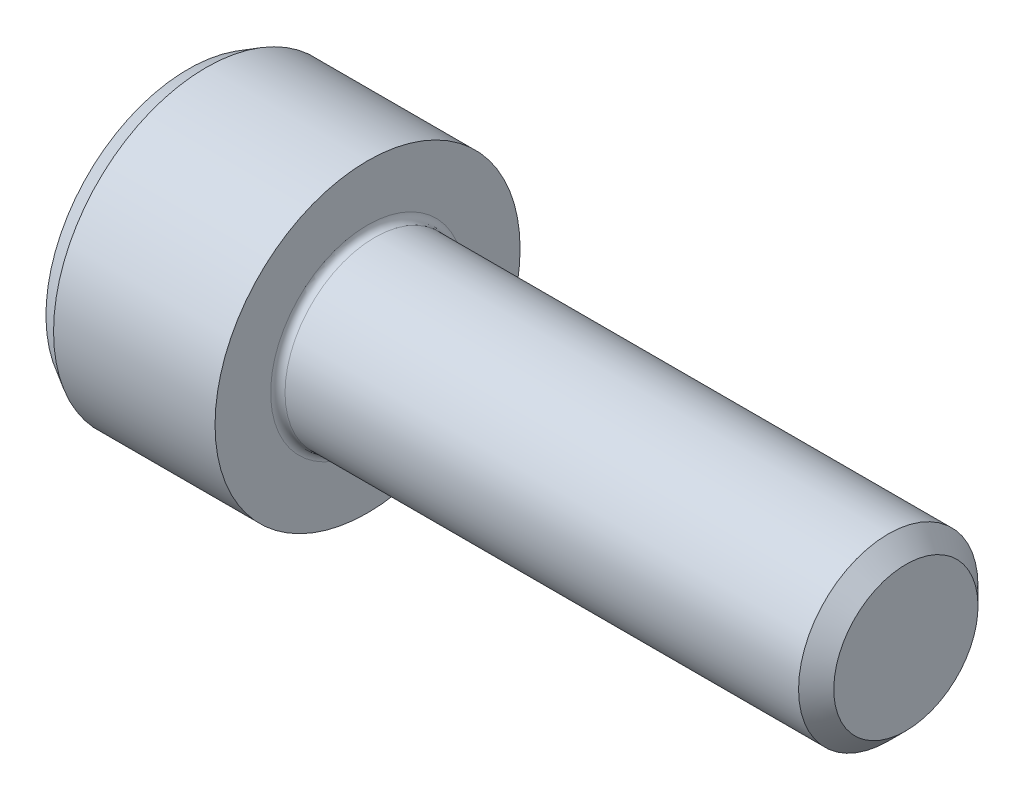
ISO-10303-21;
HEADER;
FILE_DESCRIPTION(('STEP AP214'),'2;1');
FILE_NAME('part.step','',(''),(''),'','','');
FILE_SCHEMA(('AUTOMOTIVE_DESIGN { 1 0 10303 214 1 1 1 1 }'));
ENDSEC;
DATA;
#1=APPLICATION_CONTEXT('core data for automotive mechanical design processes');
#2=APPLICATION_PROTOCOL_DEFINITION('international standard','automotive_design',2000,#1);
#3=PRODUCT_CONTEXT('',#1,'mechanical');
#4=PRODUCT('Part','Part','',(#3));
#5=PRODUCT_RELATED_PRODUCT_CATEGORY('part','',(#4));
#6=PRODUCT_DEFINITION_FORMATION('','',#4);
#7=PRODUCT_DEFINITION_CONTEXT('part definition',#1,'design');
#8=PRODUCT_DEFINITION('design','',#6,#7);
#9=PRODUCT_DEFINITION_SHAPE('','',#8);
#10=(LENGTH_UNIT() NAMED_UNIT(*) SI_UNIT(.MILLI.,.METRE.));
#11=(NAMED_UNIT(*) PLANE_ANGLE_UNIT() SI_UNIT($,.RADIAN.));
#12=(NAMED_UNIT(*) SI_UNIT($,.STERADIAN.) SOLID_ANGLE_UNIT());
#13=UNCERTAINTY_MEASURE_WITH_UNIT(LENGTH_MEASURE(1.E-05),#10,'distance_accuracy_value','');
#14=(GEOMETRIC_REPRESENTATION_CONTEXT(3) GLOBAL_UNCERTAINTY_ASSIGNED_CONTEXT((#13)) GLOBAL_UNIT_ASSIGNED_CONTEXT((#10,
#11,#12)) REPRESENTATION_CONTEXT('',''));
#15=CARTESIAN_POINT('',(0.,0.,0.));
#16=DIRECTION('',(0.,0.,1.));
#17=DIRECTION('',(1.,0.,0.));
#18=AXIS2_PLACEMENT_3D('',#15,#16,#17);
#19=CARTESIAN_POINT('',(-5.,0.,0.));
#20=DIRECTION('',(1.,0.,0.));
#21=DIRECTION('',(0.,1.,0.));
#22=AXIS2_PLACEMENT_3D('',#19,#20,#21);
#23=PLANE('',#22);
#24=CARTESIAN_POINT('',(-5.,0.,0.));
#25=DIRECTION('',(-1.,0.,0.));
#26=DIRECTION('',(0.,-1.,0.));
#27=AXIS2_PLACEMENT_3D('',#24,#25,#26);
#28=CIRCLE('',#27,3.96132486540518);
#29=CARTESIAN_POINT('',(-5.,-3.96132486540517,0.));
#30=VERTEX_POINT('',#29);
#31=EDGE_CURVE('E149',#30,#30,#28,.T.);
#32=ORIENTED_EDGE('',*,*,#31,.T.);
#33=EDGE_LOOP('',(#32));
#34=FACE_BOUND('',#33,.T.);
#35=DIRECTION('',(0.,0.5,-0.866025403784439));
#36=VECTOR('',#35,1.);
#37=CARTESIAN_POINT('',(-5.,-2.3094010767585,0.));
#38=LINE('',#37,#36);
#39=CARTESIAN_POINT('',(-5.,-2.3094010767585,0.));
#40=VERTEX_POINT('',#39);
#41=CARTESIAN_POINT('',(-5.,-1.15470053837925,-2.));
#42=VERTEX_POINT('',#41);
#43=EDGE_CURVE('E433',#40,#42,#38,.T.);
#44=ORIENTED_EDGE('',*,*,#43,.T.);
#45=DIRECTION('',(0.,1.,0.));
#46=VECTOR('',#45,1.);
#47=CARTESIAN_POINT('',(-5.,-1.15470053837925,-2.));
#48=LINE('',#47,#46);
#49=CARTESIAN_POINT('',(-5.,1.15470053837925,-2.));
#50=VERTEX_POINT('',#49);
#51=EDGE_CURVE('E435',#42,#50,#48,.T.);
#52=ORIENTED_EDGE('',*,*,#51,.T.);
#53=DIRECTION('',(0.,0.5,0.866025403784439));
#54=VECTOR('',#53,1.);
#55=CARTESIAN_POINT('',(-5.,1.15470053837925,-2.));
#56=LINE('',#55,#54);
#57=CARTESIAN_POINT('',(-5.,2.3094010767585,0.));
#58=VERTEX_POINT('',#57);
#59=EDGE_CURVE('E437',#50,#58,#56,.T.);
#60=ORIENTED_EDGE('',*,*,#59,.T.);
#61=DIRECTION('',(0.,-0.5,0.866025403784439));
#62=VECTOR('',#61,1.);
#63=CARTESIAN_POINT('',(-5.,2.3094010767585,0.));
#64=LINE('',#63,#62);
#65=CARTESIAN_POINT('',(-5.,1.15470053837925,2.));
#66=VERTEX_POINT('',#65);
#67=EDGE_CURVE('E123',#58,#66,#64,.T.);
#68=ORIENTED_EDGE('',*,*,#67,.T.);
#69=DIRECTION('',(0.,-1.,0.));
#70=VECTOR('',#69,1.);
#71=CARTESIAN_POINT('',(-5.,1.15470053837925,2.));
#72=LINE('',#71,#70);
#73=CARTESIAN_POINT('',(-5.,-1.15470053837925,2.));
#74=VERTEX_POINT('',#73);
#75=EDGE_CURVE('E430',#66,#74,#72,.T.);
#76=ORIENTED_EDGE('',*,*,#75,.T.);
#77=DIRECTION('',(0.,-0.5,-0.866025403784439));
#78=VECTOR('',#77,1.);
#79=CARTESIAN_POINT('',(-5.,-1.15470053837925,2.));
#80=LINE('',#79,#78);
#81=EDGE_CURVE('E138',#74,#40,#80,.T.);
#82=ORIENTED_EDGE('',*,*,#81,.T.);
#83=EDGE_LOOP('',(#44,#52,#60,#68,#76,#82));
#84=FACE_BOUND('',#83,.T.);
#85=ADVANCED_FACE('F39',(#34,#84),#23,.F.);
#86=CARTESIAN_POINT('',(15.,2.00950000000001,0.));
#87=DIRECTION('',(-1.,0.,0.));
#88=DIRECTION('',(0.,-1.,0.));
#89=AXIS2_PLACEMENT_3D('',#86,#87,#88);
#90=PLANE('',#89);
#91=CARTESIAN_POINT('',(15.,0.,0.));
#92=DIRECTION('',(-1.,0.,0.));
#93=DIRECTION('',(0.,-1.,0.));
#94=AXIS2_PLACEMENT_3D('',#91,#92,#93);
#95=CIRCLE('',#94,2.00950000000001);
#96=CARTESIAN_POINT('',(15.,-2.00950000000001,0.));
#97=VERTEX_POINT('',#96);
#98=EDGE_CURVE('E11',#97,#97,#95,.T.);
#99=ORIENTED_EDGE('',*,*,#98,.F.);
#100=EDGE_LOOP('',(#99));
#101=FACE_BOUND('',#100,.T.);
#102=ADVANCED_FACE('F41',(#101),#90,.F.);
#103=CARTESIAN_POINT('',(15.,0.,0.));
#104=DIRECTION('',(-1.,0.,0.));
#105=DIRECTION('',(0.,-1.,0.));
#106=AXIS2_PLACEMENT_3D('',#103,#104,#105);
#107=CONICAL_SURFACE('',#106,2.00950000000001,0.785398163397447);
#108=CARTESIAN_POINT('',(14.5095,0.,0.));
#109=DIRECTION('',(-1.,0.,0.));
#110=DIRECTION('',(0.,-1.,0.));
#111=AXIS2_PLACEMENT_3D('',#108,#109,#110);
#112=CIRCLE('',#111,2.5);
#113=CARTESIAN_POINT('',(14.5095,-2.5,0.));
#114=VERTEX_POINT('',#113);
#115=EDGE_CURVE('E47',#114,#114,#112,.T.);
#116=ORIENTED_EDGE('',*,*,#115,.F.);
#117=EDGE_LOOP('',(#116));
#118=FACE_BOUND('',#117,.T.);
#119=ORIENTED_EDGE('',*,*,#98,.T.);
#120=EDGE_LOOP('',(#119));
#121=FACE_BOUND('',#120,.T.);
#122=ADVANCED_FACE('F169',(#118,#121),#107,.T.);
#123=CARTESIAN_POINT('',(15.,0.,0.));
#124=DIRECTION('',(-1.,0.,0.));
#125=DIRECTION('',(0.,-1.,0.));
#126=AXIS2_PLACEMENT_3D('',#123,#124,#125);
#127=CYLINDRICAL_SURFACE('',#126,2.5);
#128=CARTESIAN_POINT('',(0.199999999999987,0.,0.));
#129=DIRECTION('',(-1.,0.,0.));
#130=DIRECTION('',(0.,-1.,0.));
#131=AXIS2_PLACEMENT_3D('',#128,#129,#130);
#132=CIRCLE('',#131,2.49999999999999);
#133=CARTESIAN_POINT('',(0.199999999999986,-2.49999999999999,0.));
#134=VERTEX_POINT('',#133);
#135=EDGE_CURVE('E162',#134,#134,#132,.T.);
#136=ORIENTED_EDGE('',*,*,#135,.F.);
#137=EDGE_LOOP('',(#136));
#138=FACE_BOUND('',#137,.T.);
#139=ORIENTED_EDGE('',*,*,#115,.T.);
#140=EDGE_LOOP('',(#139));
#141=FACE_BOUND('',#140,.T.);
#142=ADVANCED_FACE('F167',(#138,#141),#127,.T.);
#143=CARTESIAN_POINT('',(0.199999999999999,0.,0.));
#144=DIRECTION('',(-1.,0.,0.));
#145=DIRECTION('',(0.,-1.,0.));
#146=AXIS2_PLACEMENT_3D('',#143,#144,#145);
#147=TOROIDAL_SURFACE('',#146,2.7,0.200000000000001);
#148=CARTESIAN_POINT('',(0.,0.,0.));
#149=DIRECTION('',(-1.,0.,0.));
#150=DIRECTION('',(0.,-1.,0.));
#151=AXIS2_PLACEMENT_3D('',#148,#149,#150);
#152=CIRCLE('',#151,2.69999999999999);
#153=CARTESIAN_POINT('',(0.,-2.69999999999999,0.));
#154=VERTEX_POINT('',#153);
#155=EDGE_CURVE('E159',#154,#154,#152,.T.);
#156=ORIENTED_EDGE('',*,*,#155,.F.);
#157=EDGE_LOOP('',(#156));
#158=FACE_BOUND('',#157,.T.);
#159=ORIENTED_EDGE('',*,*,#135,.T.);
#160=EDGE_LOOP('',(#159));
#161=FACE_BOUND('',#160,.T.);
#162=ADVANCED_FACE('F198',(#158,#161),#147,.F.);
#163=CARTESIAN_POINT('',(0.,4.25,0.));
#164=DIRECTION('',(-1.,0.,0.));
#165=DIRECTION('',(0.,-1.,0.));
#166=AXIS2_PLACEMENT_3D('',#163,#164,#165);
#167=PLANE('',#166);
#168=CARTESIAN_POINT('',(0.,0.,0.));
#169=DIRECTION('',(-1.,0.,0.));
#170=DIRECTION('',(0.,-1.,0.));
#171=AXIS2_PLACEMENT_3D('',#168,#169,#170);
#172=CIRCLE('',#171,4.24999999999999);
#173=CARTESIAN_POINT('',(0.,-4.24999999999999,0.));
#174=VERTEX_POINT('',#173);
#175=EDGE_CURVE('E156',#174,#174,#172,.T.);
#176=ORIENTED_EDGE('',*,*,#175,.F.);
#177=EDGE_LOOP('',(#176));
#178=FACE_BOUND('',#177,.T.);
#179=ORIENTED_EDGE('',*,*,#155,.T.);
#180=EDGE_LOOP('',(#179));
#181=FACE_BOUND('',#180,.T.);
#182=ADVANCED_FACE('F194',(#178,#181),#167,.F.);
#183=CARTESIAN_POINT('',(15.,0.,0.));
#184=DIRECTION('',(-1.,0.,0.));
#185=DIRECTION('',(0.,-1.,0.));
#186=AXIS2_PLACEMENT_3D('',#183,#184,#185);
#187=CYLINDRICAL_SURFACE('',#186,4.24999999999999);
#188=CARTESIAN_POINT('',(-4.5,0.,0.));
#189=DIRECTION('',(-1.,0.,0.));
#190=DIRECTION('',(0.,-1.,0.));
#191=AXIS2_PLACEMENT_3D('',#188,#189,#190);
#192=CIRCLE('',#191,4.24999999999999);
#193=CARTESIAN_POINT('',(-4.5,-4.24999999999999,0.));
#194=VERTEX_POINT('',#193);
#195=EDGE_CURVE('E153',#194,#194,#192,.T.);
#196=ORIENTED_EDGE('',*,*,#195,.F.);
#197=EDGE_LOOP('',(#196));
#198=FACE_BOUND('',#197,.T.);
#199=ORIENTED_EDGE('',*,*,#175,.T.);
#200=EDGE_LOOP('',(#199));
#201=FACE_BOUND('',#200,.T.);
#202=ADVANCED_FACE('F190',(#198,#201),#187,.T.);
#203=CARTESIAN_POINT('',(-4.5,0.,0.));
#204=DIRECTION('',(1.,0.,0.));
#205=DIRECTION('',(0.,1.,0.));
#206=AXIS2_PLACEMENT_3D('',#203,#204,#205);
#207=CONICAL_SURFACE('',#206,4.24999999999999,0.523598775598296);
#208=ORIENTED_EDGE('',*,*,#31,.F.);
#209=EDGE_LOOP('',(#208));
#210=FACE_BOUND('',#209,.T.);
#211=ORIENTED_EDGE('',*,*,#195,.T.);
#212=EDGE_LOOP('',(#211));
#213=FACE_BOUND('',#212,.T.);
#214=ADVANCED_FACE('F187',(#210,#213),#207,.T.);
#215=CARTESIAN_POINT('',(-2.5,1.15470053837925,2.));
#216=DIRECTION('',(0.,0.,-1.));
#217=DIRECTION('',(-1.,0.,0.));
#218=AXIS2_PLACEMENT_3D('',#215,#216,#217);
#219=PLANE('',#218);
#220=DIRECTION('',(0.,-1.,0.));
#221=VECTOR('',#220,1.);
#222=CARTESIAN_POINT('',(-2.5,1.15470053837925,2.));
#223=LINE('',#222,#221);
#224=CARTESIAN_POINT('',(-2.5,1.15470053837925,2.));
#225=VERTEX_POINT('',#224);
#226=CARTESIAN_POINT('',(-2.5,0.,2.));
#227=VERTEX_POINT('',#226);
#228=EDGE_CURVE('E120',#225,#227,#223,.T.);
#229=ORIENTED_EDGE('',*,*,#228,.T.);
#230=CARTESIAN_POINT('',(-2.5,-1.15470053837925,2.));
#231=VERTEX_POINT('',#230);
#232=EDGE_CURVE('E112',#227,#231,#223,.T.);
#233=ORIENTED_EDGE('',*,*,#232,.T.);
#234=DIRECTION('',(-1.,0.,0.));
#235=VECTOR('',#234,1.);
#236=CARTESIAN_POINT('',(-2.5,-1.15470053837925,2.));
#237=LINE('',#236,#235);
#238=EDGE_CURVE('E117',#231,#74,#237,.T.);
#239=ORIENTED_EDGE('',*,*,#238,.T.);
#240=ORIENTED_EDGE('',*,*,#75,.F.);
#241=DIRECTION('',(-1.,0.,0.));
#242=VECTOR('',#241,1.);
#243=CARTESIAN_POINT('',(-2.5,1.15470053837925,2.));
#244=LINE('',#243,#242);
#245=EDGE_CURVE('E425',#225,#66,#244,.T.);
#246=ORIENTED_EDGE('',*,*,#245,.F.);
#247=EDGE_LOOP('',(#229,#233,#239,#240,#246));
#248=FACE_BOUND('',#247,.T.);
#249=ADVANCED_FACE('F114',(#248),#219,.T.);
#250=CARTESIAN_POINT('',(-2.5,-1.15470053837925,2.));
#251=DIRECTION('',(0.,0.866025403784439,-0.5));
#252=DIRECTION('',(0.,0.5,0.866025403784439));
#253=AXIS2_PLACEMENT_3D('',#250,#251,#252);
#254=PLANE('',#253);
#255=DIRECTION('',(0.,-0.5,-0.866025403784439));
#256=VECTOR('',#255,1.);
#257=CARTESIAN_POINT('',(-2.5,-1.15470053837925,2.));
#258=LINE('',#257,#256);
#259=CARTESIAN_POINT('',(-2.5,-1.73205080756888,1.));
#260=VERTEX_POINT('',#259);
#261=EDGE_CURVE('E126',#231,#260,#258,.T.);
#262=ORIENTED_EDGE('',*,*,#261,.T.);
#263=CARTESIAN_POINT('',(-2.5,-2.3094010767585,0.));
#264=VERTEX_POINT('',#263);
#265=EDGE_CURVE('E133',#260,#264,#258,.T.);
#266=ORIENTED_EDGE('',*,*,#265,.T.);
#267=DIRECTION('',(-1.,0.,0.));
#268=VECTOR('',#267,1.);
#269=CARTESIAN_POINT('',(-2.5,-2.3094010767585,0.));
#270=LINE('',#269,#268);
#271=EDGE_CURVE('E139',#264,#40,#270,.T.);
#272=ORIENTED_EDGE('',*,*,#271,.T.);
#273=ORIENTED_EDGE('',*,*,#81,.F.);
#274=ORIENTED_EDGE('',*,*,#238,.F.);
#275=EDGE_LOOP('',(#262,#266,#272,#273,#274));
#276=FACE_BOUND('',#275,.T.);
#277=ADVANCED_FACE('F136',(#276),#254,.T.);
#278=CARTESIAN_POINT('',(-2.5,-2.3094010767585,0.));
#279=DIRECTION('',(0.,0.866025403784439,0.5));
#280=DIRECTION('',(0.,-0.5,0.866025403784439));
#281=AXIS2_PLACEMENT_3D('',#278,#279,#280);
#282=PLANE('',#281);
#283=DIRECTION('',(0.,0.5,-0.866025403784439));
#284=VECTOR('',#283,1.);
#285=CARTESIAN_POINT('',(-2.5,-2.3094010767585,0.));
#286=LINE('',#285,#284);
#287=CARTESIAN_POINT('',(-2.5,-1.73205080756888,-1.));
#288=VERTEX_POINT('',#287);
#289=EDGE_CURVE('E54',#264,#288,#286,.T.);
#290=ORIENTED_EDGE('',*,*,#289,.T.);
#291=CARTESIAN_POINT('',(-2.5,-1.15470053837925,-2.));
#292=VERTEX_POINT('',#291);
#293=EDGE_CURVE('E132',#288,#292,#286,.T.);
#294=ORIENTED_EDGE('',*,*,#293,.T.);
#295=DIRECTION('',(-1.,0.,0.));
#296=VECTOR('',#295,1.);
#297=CARTESIAN_POINT('',(-2.5,-1.15470053837925,-2.));
#298=LINE('',#297,#296);
#299=EDGE_CURVE('E144',#292,#42,#298,.T.);
#300=ORIENTED_EDGE('',*,*,#299,.T.);
#301=ORIENTED_EDGE('',*,*,#43,.F.);
#302=ORIENTED_EDGE('',*,*,#271,.F.);
#303=EDGE_LOOP('',(#290,#294,#300,#301,#302));
#304=FACE_BOUND('',#303,.T.);
#305=ADVANCED_FACE('F241',(#304),#282,.T.);
#306=CARTESIAN_POINT('',(-2.5,-1.15470053837925,-2.));
#307=DIRECTION('',(0.,0.,1.));
#308=DIRECTION('',(1.,0.,0.));
#309=AXIS2_PLACEMENT_3D('',#306,#307,#308);
#310=PLANE('',#309);
#311=DIRECTION('',(0.,1.,0.));
#312=VECTOR('',#311,1.);
#313=CARTESIAN_POINT('',(-2.5,-1.15470053837925,-2.));
#314=LINE('',#313,#312);
#315=CARTESIAN_POINT('',(-2.5,0.,-2.));
#316=VERTEX_POINT('',#315);
#317=EDGE_CURVE('E455',#292,#316,#314,.T.);
#318=ORIENTED_EDGE('',*,*,#317,.T.);
#319=CARTESIAN_POINT('',(-2.5,1.15470053837925,-2.));
#320=VERTEX_POINT('',#319);
#321=EDGE_CURVE('E453',#316,#320,#314,.T.);
#322=ORIENTED_EDGE('',*,*,#321,.T.);
#323=DIRECTION('',(-1.,0.,0.));
#324=VECTOR('',#323,1.);
#325=CARTESIAN_POINT('',(-2.5,1.15470053837925,-2.));
#326=LINE('',#325,#324);
#327=EDGE_CURVE('E441',#320,#50,#326,.T.);
#328=ORIENTED_EDGE('',*,*,#327,.T.);
#329=ORIENTED_EDGE('',*,*,#51,.F.);
#330=ORIENTED_EDGE('',*,*,#299,.F.);
#331=EDGE_LOOP('',(#318,#322,#328,#329,#330));
#332=FACE_BOUND('',#331,.T.);
#333=ADVANCED_FACE('F248',(#332),#310,.T.);
#334=CARTESIAN_POINT('',(-2.5,1.15470053837925,-2.));
#335=DIRECTION('',(0.,-0.866025403784439,0.5));
#336=DIRECTION('',(0.,-0.5,-0.866025403784439));
#337=AXIS2_PLACEMENT_3D('',#334,#335,#336);
#338=PLANE('',#337);
#339=DIRECTION('',(0.,0.5,0.866025403784439));
#340=VECTOR('',#339,1.);
#341=CARTESIAN_POINT('',(-2.5,1.15470053837925,-2.));
#342=LINE('',#341,#340);
#343=CARTESIAN_POINT('',(-2.5,1.73205080756888,-1.));
#344=VERTEX_POINT('',#343);
#345=EDGE_CURVE('E417',#320,#344,#342,.T.);
#346=ORIENTED_EDGE('',*,*,#345,.T.);
#347=CARTESIAN_POINT('',(-2.5,2.3094010767585,0.));
#348=VERTEX_POINT('',#347);
#349=EDGE_CURVE('E456',#344,#348,#342,.T.);
#350=ORIENTED_EDGE('',*,*,#349,.T.);
#351=DIRECTION('',(-1.,0.,0.));
#352=VECTOR('',#351,1.);
#353=CARTESIAN_POINT('',(-2.5,2.3094010767585,0.));
#354=LINE('',#353,#352);
#355=EDGE_CURVE('E423',#348,#58,#354,.T.);
#356=ORIENTED_EDGE('',*,*,#355,.T.);
#357=ORIENTED_EDGE('',*,*,#59,.F.);
#358=ORIENTED_EDGE('',*,*,#327,.F.);
#359=EDGE_LOOP('',(#346,#350,#356,#357,#358));
#360=FACE_BOUND('',#359,.T.);
#361=ADVANCED_FACE('F255',(#360),#338,.T.);
#362=CARTESIAN_POINT('',(-2.5,2.3094010767585,0.));
#363=DIRECTION('',(0.,-0.866025403784439,-0.5));
#364=DIRECTION('',(0.,0.5,-0.866025403784439));
#365=AXIS2_PLACEMENT_3D('',#362,#363,#364);
#366=PLANE('',#365);
#367=DIRECTION('',(0.,-0.5,0.866025403784439));
#368=VECTOR('',#367,1.);
#369=CARTESIAN_POINT('',(-2.5,2.3094010767585,0.));
#370=LINE('',#369,#368);
#371=CARTESIAN_POINT('',(-2.5,1.73205080756888,1.));
#372=VERTEX_POINT('',#371);
#373=EDGE_CURVE('E416',#348,#372,#370,.T.);
#374=ORIENTED_EDGE('',*,*,#373,.T.);
#375=EDGE_CURVE('E413',#372,#225,#370,.T.);
#376=ORIENTED_EDGE('',*,*,#375,.T.);
#377=ORIENTED_EDGE('',*,*,#245,.T.);
#378=ORIENTED_EDGE('',*,*,#67,.F.);
#379=ORIENTED_EDGE('',*,*,#355,.F.);
#380=EDGE_LOOP('',(#374,#376,#377,#378,#379));
#381=FACE_BOUND('',#380,.T.);
#382=ADVANCED_FACE('F263',(#381),#366,.T.);
#383=CARTESIAN_POINT('',(-2.5,0.,0.));
#384=DIRECTION('',(1.,0.,0.));
#385=DIRECTION('',(0.,0.,-1.));
#386=AXIS2_PLACEMENT_3D('',#383,#384,#385);
#387=PLANE('',#386);
#388=CARTESIAN_POINT('',(-2.5,0.,0.));
#389=DIRECTION('',(-1.,0.,0.));
#390=DIRECTION('',(0.,0.,1.));
#391=AXIS2_PLACEMENT_3D('',#388,#389,#390);
#392=CIRCLE('',#391,2.);
#393=EDGE_CURVE('E460',#344,#316,#392,.T.);
#394=ORIENTED_EDGE('',*,*,#393,.F.);
#395=ORIENTED_EDGE('',*,*,#345,.F.);
#396=ORIENTED_EDGE('',*,*,#321,.F.);
#397=EDGE_LOOP('',(#394,#395,#396));
#398=FACE_BOUND('',#397,.T.);
#399=ADVANCED_FACE('F271',(#398),#387,.F.);
#400=EDGE_CURVE('E150',#372,#344,#392,.T.);
#401=ORIENTED_EDGE('',*,*,#400,.F.);
#402=ORIENTED_EDGE('',*,*,#373,.F.);
#403=ORIENTED_EDGE('',*,*,#349,.F.);
#404=EDGE_LOOP('',(#401,#402,#403));
#405=FACE_BOUND('',#404,.T.);
#406=ADVANCED_FACE('F278',(#405),#387,.F.);
#407=EDGE_CURVE('E143',#227,#372,#392,.T.);
#408=ORIENTED_EDGE('',*,*,#407,.F.);
#409=ORIENTED_EDGE('',*,*,#228,.F.);
#410=ORIENTED_EDGE('',*,*,#375,.F.);
#411=EDGE_LOOP('',(#408,#409,#410));
#412=FACE_BOUND('',#411,.T.);
#413=ADVANCED_FACE('F287',(#412),#387,.F.);
#414=EDGE_CURVE('E128',#260,#227,#392,.T.);
#415=ORIENTED_EDGE('',*,*,#414,.F.);
#416=ORIENTED_EDGE('',*,*,#261,.F.);
#417=ORIENTED_EDGE('',*,*,#232,.F.);
#418=EDGE_LOOP('',(#415,#416,#417));
#419=FACE_BOUND('',#418,.T.);
#420=ADVANCED_FACE('F127',(#419),#387,.F.);
#421=EDGE_CURVE('E141',#288,#260,#392,.T.);
#422=ORIENTED_EDGE('',*,*,#421,.F.);
#423=ORIENTED_EDGE('',*,*,#289,.F.);
#424=ORIENTED_EDGE('',*,*,#265,.F.);
#425=EDGE_LOOP('',(#422,#423,#424));
#426=FACE_BOUND('',#425,.T.);
#427=ADVANCED_FACE('F300',(#426),#387,.F.);
#428=EDGE_CURVE('E461',#316,#288,#392,.T.);
#429=ORIENTED_EDGE('',*,*,#428,.F.);
#430=ORIENTED_EDGE('',*,*,#317,.F.);
#431=ORIENTED_EDGE('',*,*,#293,.F.);
#432=EDGE_LOOP('',(#429,#430,#431));
#433=FACE_BOUND('',#432,.T.);
#434=ADVANCED_FACE('F281',(#433),#387,.F.);
#435=CARTESIAN_POINT('',(-1.34529946162075,0.,0.));
#436=DIRECTION('',(-1.,0.,0.));
#437=DIRECTION('',(0.,0.,1.));
#438=AXIS2_PLACEMENT_3D('',#435,#436,#437);
#439=CONICAL_SURFACE('',#438,0.,1.0471975511966);
#440=ORIENTED_EDGE('',*,*,#407,.T.);
#441=ORIENTED_EDGE('',*,*,#400,.T.);
#442=ORIENTED_EDGE('',*,*,#393,.T.);
#443=ORIENTED_EDGE('',*,*,#428,.T.);
#444=ORIENTED_EDGE('',*,*,#421,.T.);
#445=ORIENTED_EDGE('',*,*,#414,.T.);
#446=EDGE_LOOP('',(#440,#441,#442,#443,#444,#445));
#447=FACE_BOUND('',#446,.T.);
#448=CARTESIAN_POINT('',(-1.34529946162075,0.,0.));
#449=VERTEX_POINT('',#448);
#450=VERTEX_LOOP('',#449);
#451=FACE_BOUND('',#450,.T.);
#452=ADVANCED_FACE('F185',(#447,#451),#439,.F.);
#453=CLOSED_SHELL('',(#85,#102,#122,#142,#162,#182,#202,#214,#249,#277,#305,#333,#361,#382,#399,
#406,#413,#420,#427,#434,#452));
#454=MANIFOLD_SOLID_BREP('B2',#453);
#455=ADVANCED_BREP_SHAPE_REPRESENTATION('',(#18,#454),#14);
#456=SHAPE_DEFINITION_REPRESENTATION(#9,#455);
ENDSEC;
END-ISO-10303-21;
